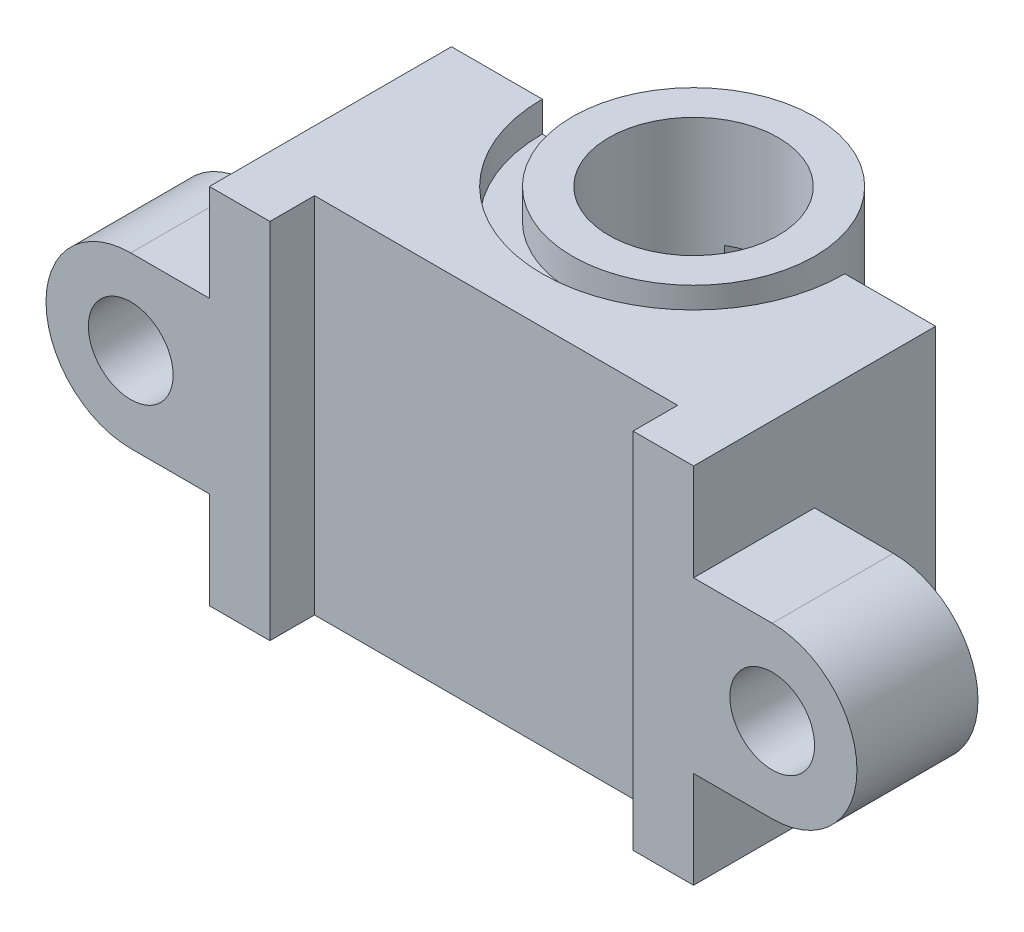
ISO-10303-21;
HEADER;
FILE_DESCRIPTION(('STEP AP214'),'2;1');
FILE_NAME('part.step','',(''),(''),'','','');
FILE_SCHEMA(('AUTOMOTIVE_DESIGN { 1 0 10303 214 1 1 1 1 }'));
ENDSEC;
DATA;
#1=APPLICATION_CONTEXT('core data for automotive mechanical design processes');
#2=APPLICATION_PROTOCOL_DEFINITION('international standard','automotive_design',2000,#1);
#3=PRODUCT_CONTEXT('',#1,'mechanical');
#4=PRODUCT('Part','Part','',(#3));
#5=PRODUCT_RELATED_PRODUCT_CATEGORY('part','',(#4));
#6=PRODUCT_DEFINITION_FORMATION('','',#4);
#7=PRODUCT_DEFINITION_CONTEXT('part definition',#1,'design');
#8=PRODUCT_DEFINITION('design','',#6,#7);
#9=PRODUCT_DEFINITION_SHAPE('','',#8);
#10=(LENGTH_UNIT() NAMED_UNIT(*) SI_UNIT(.MILLI.,.METRE.));
#11=(NAMED_UNIT(*) PLANE_ANGLE_UNIT() SI_UNIT($,.RADIAN.));
#12=(NAMED_UNIT(*) SI_UNIT($,.STERADIAN.) SOLID_ANGLE_UNIT());
#13=UNCERTAINTY_MEASURE_WITH_UNIT(LENGTH_MEASURE(1.E-05),#10,'distance_accuracy_value','');
#14=(GEOMETRIC_REPRESENTATION_CONTEXT(3) GLOBAL_UNCERTAINTY_ASSIGNED_CONTEXT((#13)) GLOBAL_UNIT_ASSIGNED_CONTEXT((#10,
#11,#12)) REPRESENTATION_CONTEXT('',''));
#15=CARTESIAN_POINT('',(0.,0.,0.));
#16=DIRECTION('',(0.,0.,1.));
#17=DIRECTION('',(1.,0.,0.));
#18=AXIS2_PLACEMENT_3D('',#15,#16,#17);
#19=CARTESIAN_POINT('',(0.,30.,-40.));
#20=DIRECTION('',(0.,-1.,0.));
#21=DIRECTION('',(0.,0.,-1.));
#22=AXIS2_PLACEMENT_3D('',#19,#20,#21);
#23=CYLINDRICAL_SURFACE('',#22,20.);
#24=CARTESIAN_POINT('',(0.,30.,-40.));
#25=DIRECTION('',(0.,-1.,0.));
#26=DIRECTION('',(0.,0.,-1.));
#27=AXIS2_PLACEMENT_3D('',#24,#25,#26);
#28=CIRCLE('',#27,20.);
#29=CARTESIAN_POINT('',(0.,30.,-60.));
#30=VERTEX_POINT('',#29);
#31=EDGE_CURVE('E408',#30,#30,#28,.T.);
#32=ORIENTED_EDGE('',*,*,#31,.T.);
#33=EDGE_LOOP('',(#32));
#34=FACE_BOUND('',#33,.T.);
#35=CARTESIAN_POINT('',(0.,25.,-40.));
#36=DIRECTION('',(0.,1.,0.));
#37=DIRECTION('',(0.,0.,1.));
#38=AXIS2_PLACEMENT_3D('',#35,#36,#37);
#39=CIRCLE('',#38,20.);
#40=CARTESIAN_POINT('',(-20.,25.,-40.));
#41=VERTEX_POINT('',#40);
#42=CARTESIAN_POINT('',(20.,25.,-40.));
#43=VERTEX_POINT('',#42);
#44=EDGE_CURVE('E219',#41,#43,#39,.T.);
#45=ORIENTED_EDGE('',*,*,#44,.T.);
#46=DIRECTION('',(0.,-1.,0.));
#47=VECTOR('',#46,1.);
#48=CARTESIAN_POINT('',(20.,30.,-40.));
#49=LINE('',#48,#47);
#50=CARTESIAN_POINT('',(20.,-25.,-40.));
#51=VERTEX_POINT('',#50);
#52=EDGE_CURVE('E400',#43,#51,#49,.T.);
#53=ORIENTED_EDGE('',*,*,#52,.T.);
#54=CARTESIAN_POINT('',(0.,-25.,-40.));
#55=DIRECTION('',(0.,-1.,0.));
#56=DIRECTION('',(0.,0.,-1.));
#57=AXIS2_PLACEMENT_3D('',#54,#55,#56);
#58=CIRCLE('',#57,20.);
#59=CARTESIAN_POINT('',(-20.,-25.,-40.));
#60=VERTEX_POINT('',#59);
#61=EDGE_CURVE('E409',#60,#51,#58,.T.);
#62=ORIENTED_EDGE('',*,*,#61,.F.);
#63=DIRECTION('',(0.,-1.,0.));
#64=VECTOR('',#63,1.);
#65=CARTESIAN_POINT('',(-20.,30.,-40.));
#66=LINE('',#65,#64);
#67=EDGE_CURVE('E405',#60,#41,#66,.F.);
#68=ORIENTED_EDGE('',*,*,#67,.T.);
#69=EDGE_LOOP('',(#45,#53,#62,#68));
#70=FACE_BOUND('',#69,.T.);
#71=DIRECTION('',(0.,-1.,0.));
#72=VECTOR('',#71,1.);
#73=CARTESIAN_POINT('',(7.,30.,-58.7349939951952));
#74=LINE('',#73,#72);
#75=CARTESIAN_POINT('',(7.,-2.,-58.7349939951952));
#76=VERTEX_POINT('',#75);
#77=CARTESIAN_POINT('',(7.,12.,-58.7349939951952));
#78=VERTEX_POINT('',#77);
#79=EDGE_CURVE('E423',#76,#78,#74,.F.);
#80=ORIENTED_EDGE('',*,*,#79,.T.);
#81=CARTESIAN_POINT('',(0.,12.,-40.));
#82=DIRECTION('',(0.,-1.,0.));
#83=DIRECTION('',(1.,0.,0.));
#84=AXIS2_PLACEMENT_3D('',#81,#82,#83);
#85=CIRCLE('',#84,20.);
#86=CARTESIAN_POINT('',(-7.,12.,-58.7349939951952));
#87=VERTEX_POINT('',#86);
#88=EDGE_CURVE('E54',#78,#87,#85,.F.);
#89=ORIENTED_EDGE('',*,*,#88,.T.);
#90=DIRECTION('',(0.,-1.,0.));
#91=VECTOR('',#90,1.);
#92=CARTESIAN_POINT('',(-7.,30.,-58.7349939951952));
#93=LINE('',#92,#91);
#94=CARTESIAN_POINT('',(-7.,-2.,-58.7349939951952));
#95=VERTEX_POINT('',#94);
#96=EDGE_CURVE('E225',#87,#95,#93,.T.);
#97=ORIENTED_EDGE('',*,*,#96,.T.);
#98=CARTESIAN_POINT('',(0.,-2.,-40.));
#99=DIRECTION('',(0.,1.,0.));
#100=DIRECTION('',(-1.,0.,0.));
#101=AXIS2_PLACEMENT_3D('',#98,#99,#100);
#102=CIRCLE('',#101,20.);
#103=EDGE_CURVE('E421',#95,#76,#102,.F.);
#104=ORIENTED_EDGE('',*,*,#103,.T.);
#105=EDGE_LOOP('',(#80,#89,#97,#104));
#106=FACE_BOUND('',#105,.T.);
#107=ADVANCED_FACE('F39',(#34,#70,#106),#23,.T.);
#108=CARTESIAN_POINT('',(0.,30.,-40.));
#109=DIRECTION('',(0.,-1.,0.));
#110=DIRECTION('',(0.,0.,-1.));
#111=AXIS2_PLACEMENT_3D('',#108,#109,#110);
#112=CYLINDRICAL_SURFACE('',#111,14.);
#113=CARTESIAN_POINT('',(0.,-25.,-40.));
#114=DIRECTION('',(0.,-1.,0.));
#115=DIRECTION('',(0.,0.,-1.));
#116=AXIS2_PLACEMENT_3D('',#113,#114,#115);
#117=CIRCLE('',#116,14.);
#118=CARTESIAN_POINT('',(0.,-25.,-54.));
#119=VERTEX_POINT('',#118);
#120=EDGE_CURVE('E415',#119,#119,#117,.T.);
#121=ORIENTED_EDGE('',*,*,#120,.T.);
#122=EDGE_LOOP('',(#121));
#123=FACE_BOUND('',#122,.T.);
#124=CARTESIAN_POINT('',(0.,30.,-40.));
#125=DIRECTION('',(0.,-1.,0.));
#126=DIRECTION('',(0.,0.,-1.));
#127=AXIS2_PLACEMENT_3D('',#124,#125,#126);
#128=CIRCLE('',#127,14.);
#129=CARTESIAN_POINT('',(0.,30.,-54.));
#130=VERTEX_POINT('',#129);
#131=EDGE_CURVE('E412',#130,#130,#128,.T.);
#132=ORIENTED_EDGE('',*,*,#131,.F.);
#133=EDGE_LOOP('',(#132));
#134=FACE_BOUND('',#133,.T.);
#135=DIRECTION('',(0.,-1.,0.));
#136=VECTOR('',#135,1.);
#137=CARTESIAN_POINT('',(-7.,30.,-52.1243556529821));
#138=LINE('',#137,#136);
#139=CARTESIAN_POINT('',(-7.,12.,-52.1243556529821));
#140=VERTEX_POINT('',#139);
#141=CARTESIAN_POINT('',(-7.,-2.,-52.1243556529822));
#142=VERTEX_POINT('',#141);
#143=EDGE_CURVE('E11',#140,#142,#138,.T.);
#144=ORIENTED_EDGE('',*,*,#143,.F.);
#145=CARTESIAN_POINT('',(0.,12.,-40.));
#146=DIRECTION('',(0.,-1.,0.));
#147=DIRECTION('',(1.,0.,0.));
#148=AXIS2_PLACEMENT_3D('',#145,#146,#147);
#149=CIRCLE('',#148,14.);
#150=CARTESIAN_POINT('',(7.,12.,-52.1243556529821));
#151=VERTEX_POINT('',#150);
#152=EDGE_CURVE('E210',#151,#140,#149,.F.);
#153=ORIENTED_EDGE('',*,*,#152,.F.);
#154=DIRECTION('',(0.,-1.,0.));
#155=VECTOR('',#154,1.);
#156=CARTESIAN_POINT('',(7.,30.,-52.1243556529821));
#157=LINE('',#156,#155);
#158=CARTESIAN_POINT('',(7.,-2.,-52.1243556529821));
#159=VERTEX_POINT('',#158);
#160=EDGE_CURVE('E218',#159,#151,#157,.F.);
#161=ORIENTED_EDGE('',*,*,#160,.F.);
#162=CARTESIAN_POINT('',(0.,-2.,-40.));
#163=DIRECTION('',(0.,1.,0.));
#164=DIRECTION('',(-1.,0.,0.));
#165=AXIS2_PLACEMENT_3D('',#162,#163,#164);
#166=CIRCLE('',#165,14.);
#167=EDGE_CURVE('E47',#142,#159,#166,.F.);
#168=ORIENTED_EDGE('',*,*,#167,.F.);
#169=EDGE_LOOP('',(#144,#153,#161,#168));
#170=FACE_BOUND('',#169,.T.);
#171=ADVANCED_FACE('F228',(#123,#134,#170),#112,.F.);
#172=CARTESIAN_POINT('',(0.,0.,-40.));
#173=DIRECTION('',(0.,0.,-1.));
#174=DIRECTION('',(-1.,0.,0.));
#175=AXIS2_PLACEMENT_3D('',#172,#173,#174);
#176=PLANE('',#175);
#177=ORIENTED_EDGE('',*,*,#52,.F.);
#178=DIRECTION('',(1.,0.,0.));
#179=VECTOR('',#178,1.);
#180=CARTESIAN_POINT('',(0.,25.,-40.));
#181=LINE('',#180,#179);
#182=CARTESIAN_POINT('',(25.,25.,-40.));
#183=VERTEX_POINT('',#182);
#184=EDGE_CURVE('E245',#43,#183,#181,.T.);
#185=ORIENTED_EDGE('',*,*,#184,.T.);
#186=DIRECTION('',(0.,1.,0.));
#187=VECTOR('',#186,1.);
#188=CARTESIAN_POINT('',(25.,25.,-40.));
#189=LINE('',#188,#187);
#190=CARTESIAN_POINT('',(25.,30.,-40.));
#191=VERTEX_POINT('',#190);
#192=EDGE_CURVE('E239',#183,#191,#189,.T.);
#193=ORIENTED_EDGE('',*,*,#192,.T.);
#194=DIRECTION('',(-1.,0.,0.));
#195=VECTOR('',#194,1.);
#196=CARTESIAN_POINT('',(-40.,30.,-40.));
#197=LINE('',#196,#195);
#198=CARTESIAN_POINT('',(40.,30.,-40.));
#199=VERTEX_POINT('',#198);
#200=EDGE_CURVE('E290',#199,#191,#197,.T.);
#201=ORIENTED_EDGE('',*,*,#200,.F.);
#202=DIRECTION('',(0.,1.,0.));
#203=VECTOR('',#202,1.);
#204=CARTESIAN_POINT('',(40.,-30.,-40.));
#205=LINE('',#204,#203);
#206=CARTESIAN_POINT('',(40.,-30.,-40.));
#207=VERTEX_POINT('',#206);
#208=EDGE_CURVE('E270',#207,#199,#205,.T.);
#209=ORIENTED_EDGE('',*,*,#208,.F.);
#210=DIRECTION('',(1.,0.,0.));
#211=VECTOR('',#210,1.);
#212=CARTESIAN_POINT('',(-40.,-30.,-40.));
#213=LINE('',#212,#211);
#214=CARTESIAN_POINT('',(25.,-30.,-40.));
#215=VERTEX_POINT('',#214);
#216=EDGE_CURVE('E286',#215,#207,#213,.T.);
#217=ORIENTED_EDGE('',*,*,#216,.F.);
#218=DIRECTION('',(0.,-1.,0.));
#219=VECTOR('',#218,1.);
#220=CARTESIAN_POINT('',(25.,-25.,-40.));
#221=LINE('',#220,#219);
#222=CARTESIAN_POINT('',(25.,-25.,-40.));
#223=VERTEX_POINT('',#222);
#224=EDGE_CURVE('E246',#223,#215,#221,.T.);
#225=ORIENTED_EDGE('',*,*,#224,.F.);
#226=DIRECTION('',(-1.,0.,0.));
#227=VECTOR('',#226,1.);
#228=CARTESIAN_POINT('',(0.,-25.,-40.));
#229=LINE('',#228,#227);
#230=EDGE_CURVE('E251',#223,#51,#229,.T.);
#231=ORIENTED_EDGE('',*,*,#230,.T.);
#232=EDGE_LOOP('',(#177,#185,#193,#201,#209,#217,#225,#231));
#233=FACE_BOUND('',#232,.T.);
#234=ADVANCED_FACE('F450',(#233),#176,.T.);
#235=ORIENTED_EDGE('',*,*,#67,.F.);
#236=CARTESIAN_POINT('',(-25.,-25.,-40.));
#237=VERTEX_POINT('',#236);
#238=EDGE_CURVE('E253',#60,#237,#229,.T.);
#239=ORIENTED_EDGE('',*,*,#238,.T.);
#240=DIRECTION('',(0.,-1.,0.));
#241=VECTOR('',#240,1.);
#242=CARTESIAN_POINT('',(-25.,-25.,-40.));
#243=LINE('',#242,#241);
#244=CARTESIAN_POINT('',(-25.,-30.,-40.));
#245=VERTEX_POINT('',#244);
#246=EDGE_CURVE('E248',#245,#237,#243,.F.);
#247=ORIENTED_EDGE('',*,*,#246,.F.);
#248=CARTESIAN_POINT('',(-40.,-30.,-40.));
#249=VERTEX_POINT('',#248);
#250=EDGE_CURVE('E258',#249,#245,#213,.T.);
#251=ORIENTED_EDGE('',*,*,#250,.F.);
#252=DIRECTION('',(0.,-1.,0.));
#253=VECTOR('',#252,1.);
#254=CARTESIAN_POINT('',(-40.,-30.,-40.));
#255=LINE('',#254,#253);
#256=CARTESIAN_POINT('',(-40.,30.,-40.));
#257=VERTEX_POINT('',#256);
#258=EDGE_CURVE('E287',#257,#249,#255,.T.);
#259=ORIENTED_EDGE('',*,*,#258,.F.);
#260=CARTESIAN_POINT('',(-25.,30.,-40.));
#261=VERTEX_POINT('',#260);
#262=EDGE_CURVE('E293',#261,#257,#197,.T.);
#263=ORIENTED_EDGE('',*,*,#262,.F.);
#264=DIRECTION('',(0.,1.,0.));
#265=VECTOR('',#264,1.);
#266=CARTESIAN_POINT('',(-25.,25.,-40.));
#267=LINE('',#266,#265);
#268=CARTESIAN_POINT('',(-25.,25.,-40.));
#269=VERTEX_POINT('',#268);
#270=EDGE_CURVE('E236',#261,#269,#267,.F.);
#271=ORIENTED_EDGE('',*,*,#270,.T.);
#272=EDGE_CURVE('E242',#269,#41,#181,.T.);
#273=ORIENTED_EDGE('',*,*,#272,.T.);
#274=EDGE_LOOP('',(#235,#239,#247,#251,#259,#263,#271,#273));
#275=FACE_BOUND('',#274,.T.);
#276=ADVANCED_FACE('F525',(#275),#176,.T.);
#277=CARTESIAN_POINT('',(0.,0.,0.));
#278=DIRECTION('',(0.,0.,-1.));
#279=DIRECTION('',(-1.,0.,0.));
#280=AXIS2_PLACEMENT_3D('',#277,#278,#279);
#281=PLANE('',#280);
#282=CARTESIAN_POINT('',(-53.,0.,0.));
#283=DIRECTION('',(0.,0.,1.));
#284=DIRECTION('',(1.,0.,0.));
#285=AXIS2_PLACEMENT_3D('',#282,#283,#284);
#286=CIRCLE('',#285,7.);
#287=CARTESIAN_POINT('',(-46.,0.,0.));
#288=VERTEX_POINT('',#287);
#289=EDGE_CURVE('E378',#288,#288,#286,.T.);
#290=ORIENTED_EDGE('',*,*,#289,.F.);
#291=EDGE_LOOP('',(#290));
#292=FACE_BOUND('',#291,.T.);
#293=DIRECTION('',(1.,0.,0.));
#294=VECTOR('',#293,1.);
#295=CARTESIAN_POINT('',(-40.,-30.,0.));
#296=LINE('',#295,#294);
#297=CARTESIAN_POINT('',(-40.,-30.,0.));
#298=VERTEX_POINT('',#297);
#299=CARTESIAN_POINT('',(-30.,-30.,0.));
#300=VERTEX_POINT('',#299);
#301=EDGE_CURVE('E267',#298,#300,#296,.T.);
#302=ORIENTED_EDGE('',*,*,#301,.T.);
#303=DIRECTION('',(0.,1.,0.));
#304=VECTOR('',#303,1.);
#305=CARTESIAN_POINT('',(-30.,-30.,0.));
#306=LINE('',#305,#304);
#307=CARTESIAN_POINT('',(-30.,30.,0.));
#308=VERTEX_POINT('',#307);
#309=EDGE_CURVE('E296',#300,#308,#306,.T.);
#310=ORIENTED_EDGE('',*,*,#309,.T.);
#311=DIRECTION('',(-1.,0.,0.));
#312=VECTOR('',#311,1.);
#313=CARTESIAN_POINT('',(-40.,30.,0.));
#314=LINE('',#313,#312);
#315=CARTESIAN_POINT('',(-40.,30.,0.));
#316=VERTEX_POINT('',#315);
#317=EDGE_CURVE('E279',#308,#316,#314,.T.);
#318=ORIENTED_EDGE('',*,*,#317,.T.);
#319=DIRECTION('',(0.,-1.,0.));
#320=VECTOR('',#319,1.);
#321=CARTESIAN_POINT('',(-40.,-30.,0.));
#322=LINE('',#321,#320);
#323=CARTESIAN_POINT('',(-40.,14.,0.));
#324=VERTEX_POINT('',#323);
#325=EDGE_CURVE('E272',#316,#324,#322,.T.);
#326=ORIENTED_EDGE('',*,*,#325,.T.);
#327=DIRECTION('',(1.,0.,0.));
#328=VECTOR('',#327,1.);
#329=CARTESIAN_POINT('',(-40.,14.,0.));
#330=LINE('',#329,#328);
#331=CARTESIAN_POINT('',(-53.,14.,0.));
#332=VERTEX_POINT('',#331);
#333=EDGE_CURVE('E376',#332,#324,#330,.T.);
#334=ORIENTED_EDGE('',*,*,#333,.F.);
#335=CARTESIAN_POINT('',(-53.,0.,0.));
#336=DIRECTION('',(0.,0.,-1.));
#337=DIRECTION('',(-1.,0.,0.));
#338=AXIS2_PLACEMENT_3D('',#335,#336,#337);
#339=CIRCLE('',#338,14.);
#340=CARTESIAN_POINT('',(-53.,-14.,0.));
#341=VERTEX_POINT('',#340);
#342=EDGE_CURVE('E374',#341,#332,#339,.T.);
#343=ORIENTED_EDGE('',*,*,#342,.F.);
#344=DIRECTION('',(-1.,0.,0.));
#345=VECTOR('',#344,1.);
#346=CARTESIAN_POINT('',(-40.,-14.,0.));
#347=LINE('',#346,#345);
#348=CARTESIAN_POINT('',(-40.,-14.,0.));
#349=VERTEX_POINT('',#348);
#350=EDGE_CURVE('E371',#349,#341,#347,.T.);
#351=ORIENTED_EDGE('',*,*,#350,.F.);
#352=EDGE_CURVE('E275',#349,#298,#322,.T.);
#353=ORIENTED_EDGE('',*,*,#352,.T.);
#354=EDGE_LOOP('',(#302,#310,#318,#326,#334,#343,#351,#353));
#355=FACE_BOUND('',#354,.T.);
#356=ADVANCED_FACE('F528',(#292,#355),#281,.F.);
#357=CARTESIAN_POINT('',(40.,-30.,-40.));
#358=DIRECTION('',(1.,0.,0.));
#359=DIRECTION('',(0.,0.,-1.));
#360=AXIS2_PLACEMENT_3D('',#357,#358,#359);
#361=PLANE('',#360);
#362=DIRECTION('',(0.,0.,1.));
#363=VECTOR('',#362,1.);
#364=CARTESIAN_POINT('',(40.,14.,-20.));
#365=LINE('',#364,#363);
#366=CARTESIAN_POINT('',(40.,14.,-20.));
#367=VERTEX_POINT('',#366);
#368=CARTESIAN_POINT('',(40.,14.,0.));
#369=VERTEX_POINT('',#368);
#370=EDGE_CURVE('E315',#367,#369,#365,.T.);
#371=ORIENTED_EDGE('',*,*,#370,.F.);
#372=DIRECTION('',(0.,-1.,0.));
#373=VECTOR('',#372,1.);
#374=CARTESIAN_POINT('',(40.,-14.,-20.));
#375=LINE('',#374,#373);
#376=CARTESIAN_POINT('',(40.,-14.,-20.));
#377=VERTEX_POINT('',#376);
#378=EDGE_CURVE('E335',#367,#377,#375,.T.);
#379=ORIENTED_EDGE('',*,*,#378,.T.);
#380=DIRECTION('',(0.,0.,1.));
#381=VECTOR('',#380,1.);
#382=CARTESIAN_POINT('',(40.,-14.,-20.));
#383=LINE('',#382,#381);
#384=CARTESIAN_POINT('',(40.,-14.,0.));
#385=VERTEX_POINT('',#384);
#386=EDGE_CURVE('E323',#377,#385,#383,.T.);
#387=ORIENTED_EDGE('',*,*,#386,.T.);
#388=DIRECTION('',(0.,1.,0.));
#389=VECTOR('',#388,1.);
#390=CARTESIAN_POINT('',(40.,-30.,0.));
#391=LINE('',#390,#389);
#392=CARTESIAN_POINT('',(40.,-30.,0.));
#393=VERTEX_POINT('',#392);
#394=EDGE_CURVE('E280',#393,#385,#391,.T.);
#395=ORIENTED_EDGE('',*,*,#394,.F.);
#396=DIRECTION('',(0.,0.,1.));
#397=VECTOR('',#396,1.);
#398=CARTESIAN_POINT('',(40.,-30.,-40.));
#399=LINE('',#398,#397);
#400=EDGE_CURVE('E264',#207,#393,#399,.T.);
#401=ORIENTED_EDGE('',*,*,#400,.F.);
#402=ORIENTED_EDGE('',*,*,#208,.T.);
#403=DIRECTION('',(0.,0.,1.));
#404=VECTOR('',#403,1.);
#405=CARTESIAN_POINT('',(40.,30.,-40.));
#406=LINE('',#405,#404);
#407=CARTESIAN_POINT('',(40.,30.,0.));
#408=VERTEX_POINT('',#407);
#409=EDGE_CURVE('E254',#199,#408,#406,.T.);
#410=ORIENTED_EDGE('',*,*,#409,.T.);
#411=EDGE_CURVE('E283',#369,#408,#391,.T.);
#412=ORIENTED_EDGE('',*,*,#411,.F.);
#413=EDGE_LOOP('',(#371,#379,#387,#395,#401,#402,#410,#412));
#414=FACE_BOUND('',#413,.T.);
#415=ADVANCED_FACE('F41',(#414),#361,.T.);
#416=CARTESIAN_POINT('',(-40.,-30.,-40.));
#417=DIRECTION('',(0.,-1.,0.));
#418=DIRECTION('',(0.,0.,-1.));
#419=AXIS2_PLACEMENT_3D('',#416,#417,#418);
#420=PLANE('',#419);
#421=CARTESIAN_POINT('',(0.,-30.,-40.));
#422=DIRECTION('',(0.,-1.,0.));
#423=DIRECTION('',(0.,0.,-1.));
#424=AXIS2_PLACEMENT_3D('',#421,#422,#423);
#425=CIRCLE('',#424,25.);
#426=EDGE_CURVE('E392',#215,#245,#425,.T.);
#427=ORIENTED_EDGE('',*,*,#426,.F.);
#428=ORIENTED_EDGE('',*,*,#216,.T.);
#429=ORIENTED_EDGE('',*,*,#400,.T.);
#430=CARTESIAN_POINT('',(30.,-30.,0.));
#431=VERTEX_POINT('',#430);
#432=EDGE_CURVE('E271',#431,#393,#296,.T.);
#433=ORIENTED_EDGE('',*,*,#432,.F.);
#434=DIRECTION('',(0.,0.,-1.));
#435=VECTOR('',#434,1.);
#436=CARTESIAN_POINT('',(30.,-30.,0.));
#437=LINE('',#436,#435);
#438=CARTESIAN_POINT('',(30.,-30.,-7.36805693327453));
#439=VERTEX_POINT('',#438);
#440=EDGE_CURVE('E318',#431,#439,#437,.T.);
#441=ORIENTED_EDGE('',*,*,#440,.T.);
#442=DIRECTION('',(-1.,0.,0.));
#443=VECTOR('',#442,1.);
#444=CARTESIAN_POINT('',(-30.,-30.,-7.36805693327453));
#445=LINE('',#444,#443);
#446=CARTESIAN_POINT('',(-30.,-30.,-7.36805693327453));
#447=VERTEX_POINT('',#446);
#448=EDGE_CURVE('E300',#439,#447,#445,.T.);
#449=ORIENTED_EDGE('',*,*,#448,.T.);
#450=DIRECTION('',(0.,0.,1.));
#451=VECTOR('',#450,1.);
#452=CARTESIAN_POINT('',(-30.,-30.,0.));
#453=LINE('',#452,#451);
#454=EDGE_CURVE('E309',#447,#300,#453,.T.);
#455=ORIENTED_EDGE('',*,*,#454,.T.);
#456=ORIENTED_EDGE('',*,*,#301,.F.);
#457=DIRECTION('',(0.,0.,1.));
#458=VECTOR('',#457,1.);
#459=CARTESIAN_POINT('',(-40.,-30.,-40.));
#460=LINE('',#459,#458);
#461=EDGE_CURVE('E261',#249,#298,#460,.T.);
#462=ORIENTED_EDGE('',*,*,#461,.F.);
#463=ORIENTED_EDGE('',*,*,#250,.T.);
#464=EDGE_LOOP('',(#427,#428,#429,#433,#441,#449,#455,#456,#462,#463));
#465=FACE_BOUND('',#464,.T.);
#466=ADVANCED_FACE('F534',(#465),#420,.T.);
#467=CARTESIAN_POINT('',(-40.,-30.,-40.));
#468=DIRECTION('',(-1.,0.,0.));
#469=DIRECTION('',(0.,0.,1.));
#470=AXIS2_PLACEMENT_3D('',#467,#468,#469);
#471=PLANE('',#470);
#472=DIRECTION('',(0.,0.,1.));
#473=VECTOR('',#472,1.);
#474=CARTESIAN_POINT('',(-40.,-14.,-20.));
#475=LINE('',#474,#473);
#476=CARTESIAN_POINT('',(-40.,-14.,-20.));
#477=VERTEX_POINT('',#476);
#478=EDGE_CURVE('E356',#477,#349,#475,.T.);
#479=ORIENTED_EDGE('',*,*,#478,.F.);
#480=DIRECTION('',(0.,-1.,0.));
#481=VECTOR('',#480,1.);
#482=CARTESIAN_POINT('',(-40.,-14.,-20.));
#483=LINE('',#482,#481);
#484=CARTESIAN_POINT('',(-40.,14.,-20.));
#485=VERTEX_POINT('',#484);
#486=EDGE_CURVE('E373',#485,#477,#483,.T.);
#487=ORIENTED_EDGE('',*,*,#486,.F.);
#488=DIRECTION('',(0.,0.,1.));
#489=VECTOR('',#488,1.);
#490=CARTESIAN_POINT('',(-40.,14.,-20.));
#491=LINE('',#490,#489);
#492=EDGE_CURVE('E359',#485,#324,#491,.T.);
#493=ORIENTED_EDGE('',*,*,#492,.T.);
#494=ORIENTED_EDGE('',*,*,#325,.F.);
#495=DIRECTION('',(0.,0.,1.));
#496=VECTOR('',#495,1.);
#497=CARTESIAN_POINT('',(-40.,30.,-40.));
#498=LINE('',#497,#496);
#499=EDGE_CURVE('E257',#257,#316,#498,.T.);
#500=ORIENTED_EDGE('',*,*,#499,.F.);
#501=ORIENTED_EDGE('',*,*,#258,.T.);
#502=ORIENTED_EDGE('',*,*,#461,.T.);
#503=ORIENTED_EDGE('',*,*,#352,.F.);
#504=EDGE_LOOP('',(#479,#487,#493,#494,#500,#501,#502,#503));
#505=FACE_BOUND('',#504,.T.);
#506=ADVANCED_FACE('F537',(#505),#471,.T.);
#507=CARTESIAN_POINT('',(-40.,30.,-40.));
#508=DIRECTION('',(0.,1.,0.));
#509=DIRECTION('',(0.,0.,1.));
#510=AXIS2_PLACEMENT_3D('',#507,#508,#509);
#511=PLANE('',#510);
#512=ORIENTED_EDGE('',*,*,#200,.T.);
#513=CARTESIAN_POINT('',(0.,30.,-40.));
#514=DIRECTION('',(0.,-1.,0.));
#515=DIRECTION('',(0.,0.,-1.));
#516=AXIS2_PLACEMENT_3D('',#513,#514,#515);
#517=CIRCLE('',#516,25.);
#518=EDGE_CURVE('E397',#191,#261,#517,.T.);
#519=ORIENTED_EDGE('',*,*,#518,.T.);
#520=ORIENTED_EDGE('',*,*,#262,.T.);
#521=ORIENTED_EDGE('',*,*,#499,.T.);
#522=ORIENTED_EDGE('',*,*,#317,.F.);
#523=DIRECTION('',(0.,0.,1.));
#524=VECTOR('',#523,1.);
#525=CARTESIAN_POINT('',(-30.,30.,0.));
#526=LINE('',#525,#524);
#527=CARTESIAN_POINT('',(-30.,30.,-7.36805693327453));
#528=VERTEX_POINT('',#527);
#529=EDGE_CURVE('E313',#528,#308,#526,.T.);
#530=ORIENTED_EDGE('',*,*,#529,.F.);
#531=DIRECTION('',(-1.,0.,0.));
#532=VECTOR('',#531,1.);
#533=CARTESIAN_POINT('',(-30.,30.,-7.36805693327453));
#534=LINE('',#533,#532);
#535=CARTESIAN_POINT('',(30.,30.,-7.36805693327453));
#536=VERTEX_POINT('',#535);
#537=EDGE_CURVE('E306',#536,#528,#534,.T.);
#538=ORIENTED_EDGE('',*,*,#537,.F.);
#539=DIRECTION('',(0.,0.,-1.));
#540=VECTOR('',#539,1.);
#541=CARTESIAN_POINT('',(30.,30.,0.));
#542=LINE('',#541,#540);
#543=CARTESIAN_POINT('',(30.,30.,0.));
#544=VERTEX_POINT('',#543);
#545=EDGE_CURVE('E310',#544,#536,#542,.T.);
#546=ORIENTED_EDGE('',*,*,#545,.F.);
#547=EDGE_CURVE('E276',#408,#544,#314,.T.);
#548=ORIENTED_EDGE('',*,*,#547,.F.);
#549=ORIENTED_EDGE('',*,*,#409,.F.);
#550=EDGE_LOOP('',(#512,#519,#520,#521,#522,#530,#538,#546,#548,#549));
#551=FACE_BOUND('',#550,.T.);
#552=ADVANCED_FACE('F532',(#551),#511,.T.);
#553=CARTESIAN_POINT('',(53.,0.,0.));
#554=DIRECTION('',(0.,0.,-1.));
#555=DIRECTION('',(-1.,0.,0.));
#556=AXIS2_PLACEMENT_3D('',#553,#554,#555);
#557=CIRCLE('',#556,7.);
#558=CARTESIAN_POINT('',(46.,0.,0.));
#559=VERTEX_POINT('',#558);
#560=EDGE_CURVE('E342',#559,#559,#557,.T.);
#561=ORIENTED_EDGE('',*,*,#560,.T.);
#562=EDGE_LOOP('',(#561));
#563=FACE_BOUND('',#562,.T.);
#564=ORIENTED_EDGE('',*,*,#547,.T.);
#565=DIRECTION('',(0.,1.,0.));
#566=VECTOR('',#565,1.);
#567=CARTESIAN_POINT('',(30.,-30.,0.));
#568=LINE('',#567,#566);
#569=EDGE_CURVE('E299',#431,#544,#568,.T.);
#570=ORIENTED_EDGE('',*,*,#569,.F.);
#571=ORIENTED_EDGE('',*,*,#432,.T.);
#572=ORIENTED_EDGE('',*,*,#394,.T.);
#573=DIRECTION('',(1.,0.,0.));
#574=VECTOR('',#573,1.);
#575=CARTESIAN_POINT('',(40.,-14.,0.));
#576=LINE('',#575,#574);
#577=CARTESIAN_POINT('',(53.,-14.,0.));
#578=VERTEX_POINT('',#577);
#579=EDGE_CURVE('E339',#385,#578,#576,.T.);
#580=ORIENTED_EDGE('',*,*,#579,.T.);
#581=CARTESIAN_POINT('',(53.,0.,0.));
#582=DIRECTION('',(0.,0.,1.));
#583=DIRECTION('',(1.,0.,0.));
#584=AXIS2_PLACEMENT_3D('',#581,#582,#583);
#585=CIRCLE('',#584,14.);
#586=CARTESIAN_POINT('',(53.,14.,0.));
#587=VERTEX_POINT('',#586);
#588=EDGE_CURVE('E336',#578,#587,#585,.T.);
#589=ORIENTED_EDGE('',*,*,#588,.T.);
#590=DIRECTION('',(-1.,0.,0.));
#591=VECTOR('',#590,1.);
#592=CARTESIAN_POINT('',(40.,14.,0.));
#593=LINE('',#592,#591);
#594=EDGE_CURVE('E332',#587,#369,#593,.T.);
#595=ORIENTED_EDGE('',*,*,#594,.T.);
#596=ORIENTED_EDGE('',*,*,#411,.T.);
#597=EDGE_LOOP('',(#564,#570,#571,#572,#580,#589,#595,#596));
#598=FACE_BOUND('',#597,.T.);
#599=ADVANCED_FACE('F523',(#563,#598),#281,.F.);
#600=CARTESIAN_POINT('',(-30.,-30.,0.));
#601=DIRECTION('',(-1.,0.,0.));
#602=DIRECTION('',(0.,0.,1.));
#603=AXIS2_PLACEMENT_3D('',#600,#601,#602);
#604=PLANE('',#603);
#605=ORIENTED_EDGE('',*,*,#529,.T.);
#606=ORIENTED_EDGE('',*,*,#309,.F.);
#607=ORIENTED_EDGE('',*,*,#454,.F.);
#608=DIRECTION('',(0.,1.,0.));
#609=VECTOR('',#608,1.);
#610=CARTESIAN_POINT('',(-30.,-30.,-7.36805693327453));
#611=LINE('',#610,#609);
#612=EDGE_CURVE('E304',#447,#528,#611,.T.);
#613=ORIENTED_EDGE('',*,*,#612,.T.);
#614=EDGE_LOOP('',(#605,#606,#607,#613));
#615=FACE_BOUND('',#614,.T.);
#616=ADVANCED_FACE('F516',(#615),#604,.F.);
#617=CARTESIAN_POINT('',(-30.,-30.,-7.36805693327453));
#618=DIRECTION('',(0.,0.,-1.));
#619=DIRECTION('',(-1.,0.,0.));
#620=AXIS2_PLACEMENT_3D('',#617,#618,#619);
#621=PLANE('',#620);
#622=ORIENTED_EDGE('',*,*,#537,.T.);
#623=ORIENTED_EDGE('',*,*,#612,.F.);
#624=ORIENTED_EDGE('',*,*,#448,.F.);
#625=DIRECTION('',(0.,1.,0.));
#626=VECTOR('',#625,1.);
#627=CARTESIAN_POINT('',(30.,-30.,-7.36805693327453));
#628=LINE('',#627,#626);
#629=EDGE_CURVE('E302',#439,#536,#628,.T.);
#630=ORIENTED_EDGE('',*,*,#629,.T.);
#631=EDGE_LOOP('',(#622,#623,#624,#630));
#632=FACE_BOUND('',#631,.T.);
#633=ADVANCED_FACE('F513',(#632),#621,.F.);
#634=CARTESIAN_POINT('',(30.,-30.,0.));
#635=DIRECTION('',(1.,0.,0.));
#636=DIRECTION('',(0.,0.,-1.));
#637=AXIS2_PLACEMENT_3D('',#634,#635,#636);
#638=PLANE('',#637);
#639=ORIENTED_EDGE('',*,*,#545,.T.);
#640=ORIENTED_EDGE('',*,*,#629,.F.);
#641=ORIENTED_EDGE('',*,*,#440,.F.);
#642=ORIENTED_EDGE('',*,*,#569,.T.);
#643=EDGE_LOOP('',(#639,#640,#641,#642));
#644=FACE_BOUND('',#643,.T.);
#645=ADVANCED_FACE('F505',(#644),#638,.F.);
#646=CARTESIAN_POINT('',(40.,14.,-20.));
#647=DIRECTION('',(0.,1.,0.));
#648=DIRECTION('',(0.,0.,1.));
#649=AXIS2_PLACEMENT_3D('',#646,#647,#648);
#650=PLANE('',#649);
#651=ORIENTED_EDGE('',*,*,#594,.F.);
#652=DIRECTION('',(0.,0.,1.));
#653=VECTOR('',#652,1.);
#654=CARTESIAN_POINT('',(53.,14.,-20.));
#655=LINE('',#654,#653);
#656=CARTESIAN_POINT('',(53.,14.,-20.));
#657=VERTEX_POINT('',#656);
#658=EDGE_CURVE('E329',#657,#587,#655,.T.);
#659=ORIENTED_EDGE('',*,*,#658,.F.);
#660=DIRECTION('',(-1.,0.,0.));
#661=VECTOR('',#660,1.);
#662=CARTESIAN_POINT('',(40.,14.,-20.));
#663=LINE('',#662,#661);
#664=EDGE_CURVE('E327',#657,#367,#663,.T.);
#665=ORIENTED_EDGE('',*,*,#664,.T.);
#666=ORIENTED_EDGE('',*,*,#370,.T.);
#667=EDGE_LOOP('',(#651,#659,#665,#666));
#668=FACE_BOUND('',#667,.T.);
#669=ADVANCED_FACE('F501',(#668),#650,.T.);
#670=CARTESIAN_POINT('',(53.,0.,-20.));
#671=DIRECTION('',(0.,0.,1.));
#672=DIRECTION('',(1.,0.,0.));
#673=AXIS2_PLACEMENT_3D('',#670,#671,#672);
#674=CYLINDRICAL_SURFACE('',#673,14.);
#675=ORIENTED_EDGE('',*,*,#588,.F.);
#676=DIRECTION('',(0.,0.,1.));
#677=VECTOR('',#676,1.);
#678=CARTESIAN_POINT('',(53.,-14.,-20.));
#679=LINE('',#678,#677);
#680=CARTESIAN_POINT('',(53.,-14.,-20.));
#681=VERTEX_POINT('',#680);
#682=EDGE_CURVE('E326',#681,#578,#679,.T.);
#683=ORIENTED_EDGE('',*,*,#682,.F.);
#684=CARTESIAN_POINT('',(53.,0.,-20.));
#685=DIRECTION('',(0.,0.,1.));
#686=DIRECTION('',(1.,0.,0.));
#687=AXIS2_PLACEMENT_3D('',#684,#685,#686);
#688=CIRCLE('',#687,14.);
#689=EDGE_CURVE('E345',#681,#657,#688,.T.);
#690=ORIENTED_EDGE('',*,*,#689,.T.);
#691=ORIENTED_EDGE('',*,*,#658,.T.);
#692=EDGE_LOOP('',(#675,#683,#690,#691));
#693=FACE_BOUND('',#692,.T.);
#694=ADVANCED_FACE('F504',(#693),#674,.T.);
#695=CARTESIAN_POINT('',(40.,-14.,-20.));
#696=DIRECTION('',(0.,-1.,0.));
#697=DIRECTION('',(0.,0.,-1.));
#698=AXIS2_PLACEMENT_3D('',#695,#696,#697);
#699=PLANE('',#698);
#700=ORIENTED_EDGE('',*,*,#579,.F.);
#701=ORIENTED_EDGE('',*,*,#386,.F.);
#702=DIRECTION('',(1.,0.,0.));
#703=VECTOR('',#702,1.);
#704=CARTESIAN_POINT('',(40.,-14.,-20.));
#705=LINE('',#704,#703);
#706=EDGE_CURVE('E348',#377,#681,#705,.T.);
#707=ORIENTED_EDGE('',*,*,#706,.T.);
#708=ORIENTED_EDGE('',*,*,#682,.T.);
#709=EDGE_LOOP('',(#700,#701,#707,#708));
#710=FACE_BOUND('',#709,.T.);
#711=ADVANCED_FACE('F499',(#710),#699,.T.);
#712=CARTESIAN_POINT('',(53.,0.,-20.));
#713=DIRECTION('',(0.,0.,1.));
#714=DIRECTION('',(1.,0.,0.));
#715=AXIS2_PLACEMENT_3D('',#712,#713,#714);
#716=PLANE('',#715);
#717=CARTESIAN_POINT('',(53.,0.,-20.));
#718=DIRECTION('',(0.,0.,-1.));
#719=DIRECTION('',(-1.,0.,0.));
#720=AXIS2_PLACEMENT_3D('',#717,#718,#719);
#721=CIRCLE('',#720,7.);
#722=CARTESIAN_POINT('',(46.,0.,-20.));
#723=VERTEX_POINT('',#722);
#724=EDGE_CURVE('E353',#723,#723,#721,.T.);
#725=ORIENTED_EDGE('',*,*,#724,.F.);
#726=EDGE_LOOP('',(#725));
#727=FACE_BOUND('',#726,.T.);
#728=ORIENTED_EDGE('',*,*,#378,.F.);
#729=ORIENTED_EDGE('',*,*,#664,.F.);
#730=ORIENTED_EDGE('',*,*,#689,.F.);
#731=ORIENTED_EDGE('',*,*,#706,.F.);
#732=EDGE_LOOP('',(#728,#729,#730,#731));
#733=FACE_BOUND('',#732,.T.);
#734=ADVANCED_FACE('F495',(#727,#733),#716,.F.);
#735=CARTESIAN_POINT('',(53.,0.,0.));
#736=DIRECTION('',(0.,0.,-1.));
#737=DIRECTION('',(-1.,0.,0.));
#738=AXIS2_PLACEMENT_3D('',#735,#736,#737);
#739=CYLINDRICAL_SURFACE('',#738,7.);
#740=ORIENTED_EDGE('',*,*,#560,.F.);
#741=EDGE_LOOP('',(#740));
#742=FACE_BOUND('',#741,.T.);
#743=ORIENTED_EDGE('',*,*,#724,.T.);
#744=EDGE_LOOP('',(#743));
#745=FACE_BOUND('',#744,.T.);
#746=ADVANCED_FACE('F485',(#742,#745),#739,.F.);
#747=CARTESIAN_POINT('',(-40.,-14.,-20.));
#748=DIRECTION('',(0.,1.,0.));
#749=DIRECTION('',(0.,0.,1.));
#750=AXIS2_PLACEMENT_3D('',#747,#748,#749);
#751=PLANE('',#750);
#752=ORIENTED_EDGE('',*,*,#350,.T.);
#753=DIRECTION('',(0.,0.,1.));
#754=VECTOR('',#753,1.);
#755=CARTESIAN_POINT('',(-53.,-14.,-20.));
#756=LINE('',#755,#754);
#757=CARTESIAN_POINT('',(-53.,-14.,-20.));
#758=VERTEX_POINT('',#757);
#759=EDGE_CURVE('E366',#758,#341,#756,.T.);
#760=ORIENTED_EDGE('',*,*,#759,.F.);
#761=DIRECTION('',(-1.,0.,0.));
#762=VECTOR('',#761,1.);
#763=CARTESIAN_POINT('',(-40.,-14.,-20.));
#764=LINE('',#763,#762);
#765=EDGE_CURVE('E363',#477,#758,#764,.T.);
#766=ORIENTED_EDGE('',*,*,#765,.F.);
#767=ORIENTED_EDGE('',*,*,#478,.T.);
#768=EDGE_LOOP('',(#752,#760,#766,#767));
#769=FACE_BOUND('',#768,.T.);
#770=ADVANCED_FACE('F481',(#769),#751,.F.);
#771=CARTESIAN_POINT('',(-53.,0.,-20.));
#772=DIRECTION('',(0.,0.,1.));
#773=DIRECTION('',(1.,0.,0.));
#774=AXIS2_PLACEMENT_3D('',#771,#772,#773);
#775=CYLINDRICAL_SURFACE('',#774,14.);
#776=ORIENTED_EDGE('',*,*,#342,.T.);
#777=DIRECTION('',(0.,0.,1.));
#778=VECTOR('',#777,1.);
#779=CARTESIAN_POINT('',(-53.,14.,-20.));
#780=LINE('',#779,#778);
#781=CARTESIAN_POINT('',(-53.,14.,-20.));
#782=VERTEX_POINT('',#781);
#783=EDGE_CURVE('E362',#782,#332,#780,.T.);
#784=ORIENTED_EDGE('',*,*,#783,.F.);
#785=CARTESIAN_POINT('',(-53.,0.,-20.));
#786=DIRECTION('',(0.,0.,-1.));
#787=DIRECTION('',(-1.,0.,0.));
#788=AXIS2_PLACEMENT_3D('',#785,#786,#787);
#789=CIRCLE('',#788,14.);
#790=EDGE_CURVE('E380',#758,#782,#789,.T.);
#791=ORIENTED_EDGE('',*,*,#790,.F.);
#792=ORIENTED_EDGE('',*,*,#759,.T.);
#793=EDGE_LOOP('',(#776,#784,#791,#792));
#794=FACE_BOUND('',#793,.T.);
#795=ADVANCED_FACE('F484',(#794),#775,.T.);
#796=CARTESIAN_POINT('',(-40.,14.,-20.));
#797=DIRECTION('',(0.,-1.,0.));
#798=DIRECTION('',(0.,0.,-1.));
#799=AXIS2_PLACEMENT_3D('',#796,#797,#798);
#800=PLANE('',#799);
#801=ORIENTED_EDGE('',*,*,#333,.T.);
#802=ORIENTED_EDGE('',*,*,#492,.F.);
#803=DIRECTION('',(1.,0.,0.));
#804=VECTOR('',#803,1.);
#805=CARTESIAN_POINT('',(-40.,14.,-20.));
#806=LINE('',#805,#804);
#807=EDGE_CURVE('E382',#782,#485,#806,.T.);
#808=ORIENTED_EDGE('',*,*,#807,.F.);
#809=ORIENTED_EDGE('',*,*,#783,.T.);
#810=EDGE_LOOP('',(#801,#802,#808,#809));
#811=FACE_BOUND('',#810,.T.);
#812=ADVANCED_FACE('F479',(#811),#800,.F.);
#813=CARTESIAN_POINT('',(-53.,0.,-20.));
#814=DIRECTION('',(0.,0.,1.));
#815=DIRECTION('',(-1.,0.,0.));
#816=AXIS2_PLACEMENT_3D('',#813,#814,#815);
#817=PLANE('',#816);
#818=CARTESIAN_POINT('',(-53.,0.,-20.));
#819=DIRECTION('',(0.,0.,1.));
#820=DIRECTION('',(1.,0.,0.));
#821=AXIS2_PLACEMENT_3D('',#818,#819,#820);
#822=CIRCLE('',#821,7.);
#823=CARTESIAN_POINT('',(-46.,0.,-20.));
#824=VERTEX_POINT('',#823);
#825=EDGE_CURVE('E386',#824,#824,#822,.T.);
#826=ORIENTED_EDGE('',*,*,#825,.T.);
#827=EDGE_LOOP('',(#826));
#828=FACE_BOUND('',#827,.T.);
#829=ORIENTED_EDGE('',*,*,#486,.T.);
#830=ORIENTED_EDGE('',*,*,#765,.T.);
#831=ORIENTED_EDGE('',*,*,#790,.T.);
#832=ORIENTED_EDGE('',*,*,#807,.T.);
#833=EDGE_LOOP('',(#829,#830,#831,#832));
#834=FACE_BOUND('',#833,.T.);
#835=ADVANCED_FACE('F475',(#828,#834),#817,.F.);
#836=CARTESIAN_POINT('',(-53.,0.,0.));
#837=DIRECTION('',(0.,0.,-1.));
#838=DIRECTION('',(-1.,0.,0.));
#839=AXIS2_PLACEMENT_3D('',#836,#837,#838);
#840=CYLINDRICAL_SURFACE('',#839,7.);
#841=ORIENTED_EDGE('',*,*,#289,.T.);
#842=EDGE_LOOP('',(#841));
#843=FACE_BOUND('',#842,.T.);
#844=ORIENTED_EDGE('',*,*,#825,.F.);
#845=EDGE_LOOP('',(#844));
#846=FACE_BOUND('',#845,.T.);
#847=ADVANCED_FACE('F471',(#843,#846),#840,.F.);
#848=CARTESIAN_POINT('',(0.,-25.,-40.));
#849=DIRECTION('',(0.,-1.,0.));
#850=DIRECTION('',(0.,0.,-1.));
#851=AXIS2_PLACEMENT_3D('',#848,#849,#850);
#852=CYLINDRICAL_SURFACE('',#851,25.);
#853=ORIENTED_EDGE('',*,*,#224,.T.);
#854=ORIENTED_EDGE('',*,*,#426,.T.);
#855=ORIENTED_EDGE('',*,*,#246,.T.);
#856=CARTESIAN_POINT('',(0.,-25.,-40.));
#857=DIRECTION('',(0.,-1.,0.));
#858=DIRECTION('',(0.,0.,-1.));
#859=AXIS2_PLACEMENT_3D('',#856,#857,#858);
#860=CIRCLE('',#859,25.);
#861=EDGE_CURVE('E389',#223,#237,#860,.T.);
#862=ORIENTED_EDGE('',*,*,#861,.F.);
#863=EDGE_LOOP('',(#853,#854,#855,#862));
#864=FACE_BOUND('',#863,.T.);
#865=ADVANCED_FACE('F467',(#864),#852,.F.);
#866=CARTESIAN_POINT('',(0.,-25.,-40.));
#867=DIRECTION('',(0.,-1.,0.));
#868=DIRECTION('',(0.,0.,-1.));
#869=AXIS2_PLACEMENT_3D('',#866,#867,#868);
#870=PLANE('',#869);
#871=ORIENTED_EDGE('',*,*,#120,.F.);
#872=EDGE_LOOP('',(#871));
#873=FACE_BOUND('',#872,.T.);
#874=ORIENTED_EDGE('',*,*,#238,.F.);
#875=ORIENTED_EDGE('',*,*,#61,.T.);
#876=ORIENTED_EDGE('',*,*,#230,.F.);
#877=ORIENTED_EDGE('',*,*,#861,.T.);
#878=EDGE_LOOP('',(#874,#875,#876,#877));
#879=FACE_BOUND('',#878,.T.);
#880=ADVANCED_FACE('F463',(#873,#879),#870,.T.);
#881=CARTESIAN_POINT('',(0.,25.,-40.));
#882=DIRECTION('',(0.,1.,0.));
#883=DIRECTION('',(0.,0.,1.));
#884=AXIS2_PLACEMENT_3D('',#881,#882,#883);
#885=CYLINDRICAL_SURFACE('',#884,25.);
#886=ORIENTED_EDGE('',*,*,#518,.F.);
#887=ORIENTED_EDGE('',*,*,#192,.F.);
#888=CARTESIAN_POINT('',(0.,25.,-40.));
#889=DIRECTION('',(0.,-1.,0.));
#890=DIRECTION('',(0.,0.,-1.));
#891=AXIS2_PLACEMENT_3D('',#888,#889,#890);
#892=CIRCLE('',#891,25.);
#893=EDGE_CURVE('E394',#183,#269,#892,.T.);
#894=ORIENTED_EDGE('',*,*,#893,.T.);
#895=ORIENTED_EDGE('',*,*,#270,.F.);
#896=EDGE_LOOP('',(#886,#887,#894,#895));
#897=FACE_BOUND('',#896,.T.);
#898=ADVANCED_FACE('F459',(#897),#885,.F.);
#899=CARTESIAN_POINT('',(0.,25.,-40.));
#900=DIRECTION('',(0.,1.,0.));
#901=DIRECTION('',(0.,0.,-1.));
#902=AXIS2_PLACEMENT_3D('',#899,#900,#901);
#903=PLANE('',#902);
#904=ORIENTED_EDGE('',*,*,#44,.F.);
#905=ORIENTED_EDGE('',*,*,#272,.F.);
#906=ORIENTED_EDGE('',*,*,#893,.F.);
#907=ORIENTED_EDGE('',*,*,#184,.F.);
#908=EDGE_LOOP('',(#904,#905,#906,#907));
#909=FACE_BOUND('',#908,.T.);
#910=ADVANCED_FACE('F456',(#909),#903,.T.);
#911=CARTESIAN_POINT('',(0.,30.,-40.));
#912=DIRECTION('',(0.,-1.,0.));
#913=DIRECTION('',(0.,0.,-1.));
#914=AXIS2_PLACEMENT_3D('',#911,#912,#913);
#915=PLANE('',#914);
#916=ORIENTED_EDGE('',*,*,#131,.T.);
#917=EDGE_LOOP('',(#916));
#918=FACE_BOUND('',#917,.T.);
#919=ORIENTED_EDGE('',*,*,#31,.F.);
#920=EDGE_LOOP('',(#919));
#921=FACE_BOUND('',#920,.T.);
#922=ADVANCED_FACE('F441',(#918,#921),#915,.F.);
#923=CARTESIAN_POINT('',(-7.,12.,-50.));
#924=DIRECTION('',(1.,0.,0.));
#925=DIRECTION('',(0.,1.,0.));
#926=AXIS2_PLACEMENT_3D('',#923,#924,#925);
#927=PLANE('',#926);
#928=DIRECTION('',(0.,0.,-1.));
#929=VECTOR('',#928,1.);
#930=CARTESIAN_POINT('',(-7.,12.,-50.));
#931=LINE('',#930,#929);
#932=EDGE_CURVE('E213',#140,#87,#931,.T.);
#933=ORIENTED_EDGE('',*,*,#932,.F.);
#934=ORIENTED_EDGE('',*,*,#143,.T.);
#935=DIRECTION('',(0.,0.,-1.));
#936=VECTOR('',#935,1.);
#937=CARTESIAN_POINT('',(-7.,-2.,-50.));
#938=LINE('',#937,#936);
#939=EDGE_CURVE('E426',#142,#95,#938,.T.);
#940=ORIENTED_EDGE('',*,*,#939,.T.);
#941=ORIENTED_EDGE('',*,*,#96,.F.);
#942=EDGE_LOOP('',(#933,#934,#940,#941));
#943=FACE_BOUND('',#942,.T.);
#944=ADVANCED_FACE('F222',(#943),#927,.T.);
#945=CARTESIAN_POINT('',(7.,-2.,-50.));
#946=DIRECTION('',(0.,1.,0.));
#947=DIRECTION('',(-1.,0.,0.));
#948=AXIS2_PLACEMENT_3D('',#945,#946,#947);
#949=PLANE('',#948);
#950=ORIENTED_EDGE('',*,*,#939,.F.);
#951=ORIENTED_EDGE('',*,*,#167,.T.);
#952=DIRECTION('',(0.,0.,-1.));
#953=VECTOR('',#952,1.);
#954=CARTESIAN_POINT('',(7.,-2.,-50.));
#955=LINE('',#954,#953);
#956=EDGE_CURVE('E428',#159,#76,#955,.T.);
#957=ORIENTED_EDGE('',*,*,#956,.T.);
#958=ORIENTED_EDGE('',*,*,#103,.F.);
#959=EDGE_LOOP('',(#950,#951,#957,#958));
#960=FACE_BOUND('',#959,.T.);
#961=ADVANCED_FACE('F433',(#960),#949,.T.);
#962=CARTESIAN_POINT('',(7.,12.,-50.));
#963=DIRECTION('',(-1.,0.,0.));
#964=DIRECTION('',(0.,-1.,0.));
#965=AXIS2_PLACEMENT_3D('',#962,#963,#964);
#966=PLANE('',#965);
#967=ORIENTED_EDGE('',*,*,#956,.F.);
#968=ORIENTED_EDGE('',*,*,#160,.T.);
#969=DIRECTION('',(0.,0.,-1.));
#970=VECTOR('',#969,1.);
#971=CARTESIAN_POINT('',(7.,12.,-50.));
#972=LINE('',#971,#970);
#973=EDGE_CURVE('E61',#151,#78,#972,.T.);
#974=ORIENTED_EDGE('',*,*,#973,.T.);
#975=ORIENTED_EDGE('',*,*,#79,.F.);
#976=EDGE_LOOP('',(#967,#968,#974,#975));
#977=FACE_BOUND('',#976,.T.);
#978=ADVANCED_FACE('F432',(#977),#966,.T.);
#979=CARTESIAN_POINT('',(7.,12.,-50.));
#980=DIRECTION('',(0.,-1.,0.));
#981=DIRECTION('',(1.,0.,0.));
#982=AXIS2_PLACEMENT_3D('',#979,#980,#981);
#983=PLANE('',#982);
#984=ORIENTED_EDGE('',*,*,#973,.F.);
#985=ORIENTED_EDGE('',*,*,#152,.T.);
#986=ORIENTED_EDGE('',*,*,#932,.T.);
#987=ORIENTED_EDGE('',*,*,#88,.F.);
#988=EDGE_LOOP('',(#984,#985,#986,#987));
#989=FACE_BOUND('',#988,.T.);
#990=ADVANCED_FACE('F212',(#989),#983,.T.);
#991=CLOSED_SHELL('',(#107,#171,#234,#276,#356,#415,#466,#506,#552,#599,#616,#633,#645,#669,
#694,#711,#734,#746,#770,#795,#812,#835,#847,#865,#880,#898,#910,#922,#944,#961,#978,#990));
#992=MANIFOLD_SOLID_BREP('B2',#991);
#993=ADVANCED_BREP_SHAPE_REPRESENTATION('',(#18,#992),#14);
#994=SHAPE_DEFINITION_REPRESENTATION(#9,#993);
ENDSEC;
END-ISO-10303-21;
